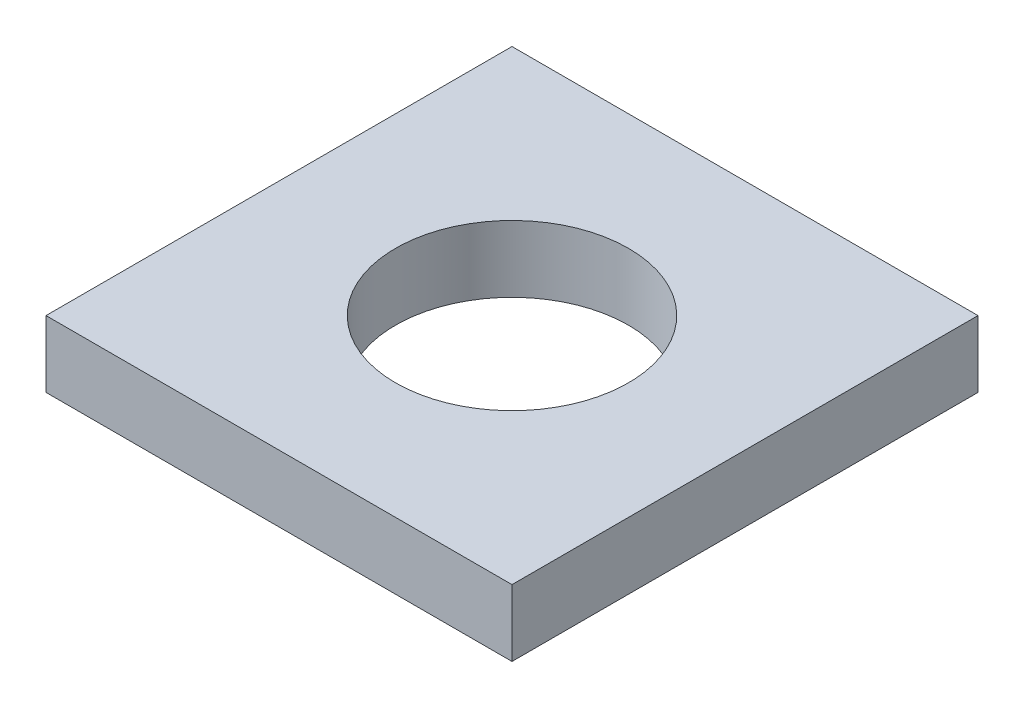
ISO-10303-21;
HEADER;
FILE_DESCRIPTION(('STEP AP214'),'2;1');
FILE_NAME('part.step','',(''),(''),'','','');
FILE_SCHEMA(('AUTOMOTIVE_DESIGN { 1 0 10303 214 1 1 1 1 }'));
ENDSEC;
DATA;
#1=APPLICATION_CONTEXT('core data for automotive mechanical design processes');
#2=APPLICATION_PROTOCOL_DEFINITION('international standard','automotive_design',2000,#1);
#3=PRODUCT_CONTEXT('',#1,'mechanical');
#4=PRODUCT('Part','Part','',(#3));
#5=PRODUCT_RELATED_PRODUCT_CATEGORY('part','',(#4));
#6=PRODUCT_DEFINITION_FORMATION('','',#4);
#7=PRODUCT_DEFINITION_CONTEXT('part definition',#1,'design');
#8=PRODUCT_DEFINITION('design','',#6,#7);
#9=PRODUCT_DEFINITION_SHAPE('','',#8);
#10=(LENGTH_UNIT() NAMED_UNIT(*) SI_UNIT(.MILLI.,.METRE.));
#11=(NAMED_UNIT(*) PLANE_ANGLE_UNIT() SI_UNIT($,.RADIAN.));
#12=(NAMED_UNIT(*) SI_UNIT($,.STERADIAN.) SOLID_ANGLE_UNIT());
#13=UNCERTAINTY_MEASURE_WITH_UNIT(LENGTH_MEASURE(1.E-05),#10,'distance_accuracy_value','');
#14=(GEOMETRIC_REPRESENTATION_CONTEXT(3) GLOBAL_UNCERTAINTY_ASSIGNED_CONTEXT((#13)) GLOBAL_UNIT_ASSIGNED_CONTEXT((#10,
#11,#12)) REPRESENTATION_CONTEXT('',''));
#15=CARTESIAN_POINT('',(0.,0.,0.));
#16=DIRECTION('',(0.,0.,1.));
#17=DIRECTION('',(1.,0.,0.));
#18=AXIS2_PLACEMENT_3D('',#15,#16,#17);
#19=CARTESIAN_POINT('',(0.,1.,0.));
#20=DIRECTION('',(0.,1.,0.));
#21=DIRECTION('',(0.,0.,1.));
#22=AXIS2_PLACEMENT_3D('',#19,#20,#21);
#23=PLANE('',#22);
#24=DIRECTION('',(0.,0.,1.));
#25=VECTOR('',#24,1.);
#26=CARTESIAN_POINT('',(-3.5,1.,-3.5));
#27=LINE('',#26,#25);
#28=CARTESIAN_POINT('',(-3.5,1.,-3.5));
#29=VERTEX_POINT('',#28);
#30=CARTESIAN_POINT('',(-3.5,1.,3.5));
#31=VERTEX_POINT('',#30);
#32=EDGE_CURVE('E102',#29,#31,#27,.T.);
#33=ORIENTED_EDGE('',*,*,#32,.T.);
#34=DIRECTION('',(1.,0.,0.));
#35=VECTOR('',#34,1.);
#36=CARTESIAN_POINT('',(-3.5,1.,3.5));
#37=LINE('',#36,#35);
#38=CARTESIAN_POINT('',(3.5,1.,3.5));
#39=VERTEX_POINT('',#38);
#40=EDGE_CURVE('E94',#31,#39,#37,.T.);
#41=ORIENTED_EDGE('',*,*,#40,.T.);
#42=DIRECTION('',(0.,0.,1.));
#43=VECTOR('',#42,1.);
#44=CARTESIAN_POINT('',(3.5,1.,-3.5));
#45=LINE('',#44,#43);
#46=CARTESIAN_POINT('',(3.5,1.,-3.5));
#47=VERTEX_POINT('',#46);
#48=EDGE_CURVE('E101',#47,#39,#45,.T.);
#49=ORIENTED_EDGE('',*,*,#48,.F.);
#50=DIRECTION('',(1.,0.,0.));
#51=VECTOR('',#50,1.);
#52=CARTESIAN_POINT('',(-3.5,1.,-3.5));
#53=LINE('',#52,#51);
#54=EDGE_CURVE('E111',#29,#47,#53,.T.);
#55=ORIENTED_EDGE('',*,*,#54,.F.);
#56=EDGE_LOOP('',(#33,#41,#49,#55));
#57=FACE_BOUND('',#56,.T.);
#58=CARTESIAN_POINT('',(0.,1.,0.));
#59=DIRECTION('',(0.,1.,0.));
#60=DIRECTION('',(0.,0.,1.));
#61=AXIS2_PLACEMENT_3D('',#58,#59,#60);
#62=CIRCLE('',#61,1.75);
#63=CARTESIAN_POINT('',(0.,1.,1.75000000000001));
#64=VERTEX_POINT('',#63);
#65=EDGE_CURVE('E118',#64,#64,#62,.T.);
#66=ORIENTED_EDGE('',*,*,#65,.F.);
#67=EDGE_LOOP('',(#66));
#68=FACE_BOUND('',#67,.T.);
#69=ADVANCED_FACE('F52',(#57,#68),#23,.T.);
#70=CARTESIAN_POINT('',(0.,0.,0.));
#71=DIRECTION('',(0.,1.,0.));
#72=DIRECTION('',(0.,0.,1.));
#73=AXIS2_PLACEMENT_3D('',#70,#71,#72);
#74=PLANE('',#73);
#75=DIRECTION('',(0.,0.,1.));
#76=VECTOR('',#75,1.);
#77=CARTESIAN_POINT('',(-3.5,0.,-3.5));
#78=LINE('',#77,#76);
#79=CARTESIAN_POINT('',(-3.5,0.,-3.5));
#80=VERTEX_POINT('',#79);
#81=CARTESIAN_POINT('',(-3.5,0.,3.5));
#82=VERTEX_POINT('',#81);
#83=EDGE_CURVE('E116',#80,#82,#78,.T.);
#84=ORIENTED_EDGE('',*,*,#83,.F.);
#85=DIRECTION('',(1.,0.,0.));
#86=VECTOR('',#85,1.);
#87=CARTESIAN_POINT('',(-3.5,0.,-3.5));
#88=LINE('',#87,#86);
#89=CARTESIAN_POINT('',(3.5,0.,-3.5));
#90=VERTEX_POINT('',#89);
#91=EDGE_CURVE('E122',#80,#90,#88,.T.);
#92=ORIENTED_EDGE('',*,*,#91,.T.);
#93=DIRECTION('',(0.,0.,1.));
#94=VECTOR('',#93,1.);
#95=CARTESIAN_POINT('',(3.5,0.,-3.5));
#96=LINE('',#95,#94);
#97=CARTESIAN_POINT('',(3.5,0.,3.5));
#98=VERTEX_POINT('',#97);
#99=EDGE_CURVE('E120',#90,#98,#96,.T.);
#100=ORIENTED_EDGE('',*,*,#99,.T.);
#101=DIRECTION('',(1.,0.,0.));
#102=VECTOR('',#101,1.);
#103=CARTESIAN_POINT('',(-3.5,0.,3.5));
#104=LINE('',#103,#102);
#105=EDGE_CURVE('E107',#82,#98,#104,.T.);
#106=ORIENTED_EDGE('',*,*,#105,.F.);
#107=EDGE_LOOP('',(#84,#92,#100,#106));
#108=FACE_BOUND('',#107,.T.);
#109=CARTESIAN_POINT('',(0.,0.,0.));
#110=DIRECTION('',(0.,1.,0.));
#111=DIRECTION('',(0.,0.,1.));
#112=AXIS2_PLACEMENT_3D('',#109,#110,#111);
#113=CIRCLE('',#112,1.75);
#114=CARTESIAN_POINT('',(0.,0.,1.75000000000001));
#115=VERTEX_POINT('',#114);
#116=EDGE_CURVE('E128',#115,#115,#113,.T.);
#117=ORIENTED_EDGE('',*,*,#116,.T.);
#118=EDGE_LOOP('',(#117));
#119=FACE_BOUND('',#118,.T.);
#120=ADVANCED_FACE('F137',(#108,#119),#74,.F.);
#121=CARTESIAN_POINT('',(-3.5,1.,-3.5));
#122=DIRECTION('',(1.,0.,0.));
#123=DIRECTION('',(0.,0.,-1.));
#124=AXIS2_PLACEMENT_3D('',#121,#122,#123);
#125=PLANE('',#124);
#126=ORIENTED_EDGE('',*,*,#83,.T.);
#127=DIRECTION('',(0.,-1.,0.));
#128=VECTOR('',#127,1.);
#129=CARTESIAN_POINT('',(-3.5,1.,3.5));
#130=LINE('',#129,#128);
#131=EDGE_CURVE('E12',#31,#82,#130,.T.);
#132=ORIENTED_EDGE('',*,*,#131,.F.);
#133=ORIENTED_EDGE('',*,*,#32,.F.);
#134=DIRECTION('',(0.,-1.,0.));
#135=VECTOR('',#134,1.);
#136=CARTESIAN_POINT('',(-3.5,1.,-3.5));
#137=LINE('',#136,#135);
#138=EDGE_CURVE('E69',#29,#80,#137,.T.);
#139=ORIENTED_EDGE('',*,*,#138,.T.);
#140=EDGE_LOOP('',(#126,#132,#133,#139));
#141=FACE_BOUND('',#140,.T.);
#142=ADVANCED_FACE('F54',(#141),#125,.F.);
#143=CARTESIAN_POINT('',(-3.5,1.,3.5));
#144=DIRECTION('',(0.,0.,-1.));
#145=DIRECTION('',(-1.,0.,0.));
#146=AXIS2_PLACEMENT_3D('',#143,#144,#145);
#147=PLANE('',#146);
#148=ORIENTED_EDGE('',*,*,#105,.T.);
#149=DIRECTION('',(0.,-1.,0.));
#150=VECTOR('',#149,1.);
#151=CARTESIAN_POINT('',(3.5,1.,3.5));
#152=LINE('',#151,#150);
#153=EDGE_CURVE('E61',#39,#98,#152,.T.);
#154=ORIENTED_EDGE('',*,*,#153,.F.);
#155=ORIENTED_EDGE('',*,*,#40,.F.);
#156=ORIENTED_EDGE('',*,*,#131,.T.);
#157=EDGE_LOOP('',(#148,#154,#155,#156));
#158=FACE_BOUND('',#157,.T.);
#159=ADVANCED_FACE('F106',(#158),#147,.F.);
#160=CARTESIAN_POINT('',(3.5,1.,-3.5));
#161=DIRECTION('',(1.,0.,0.));
#162=DIRECTION('',(0.,0.,-1.));
#163=AXIS2_PLACEMENT_3D('',#160,#161,#162);
#164=PLANE('',#163);
#165=ORIENTED_EDGE('',*,*,#99,.F.);
#166=DIRECTION('',(0.,-1.,0.));
#167=VECTOR('',#166,1.);
#168=CARTESIAN_POINT('',(3.5,1.,-3.5));
#169=LINE('',#168,#167);
#170=EDGE_CURVE('E83',#47,#90,#169,.T.);
#171=ORIENTED_EDGE('',*,*,#170,.F.);
#172=ORIENTED_EDGE('',*,*,#48,.T.);
#173=ORIENTED_EDGE('',*,*,#153,.T.);
#174=EDGE_LOOP('',(#165,#171,#172,#173));
#175=FACE_BOUND('',#174,.T.);
#176=ADVANCED_FACE('F110',(#175),#164,.T.);
#177=CARTESIAN_POINT('',(-3.5,1.,-3.5));
#178=DIRECTION('',(0.,0.,-1.));
#179=DIRECTION('',(-1.,0.,0.));
#180=AXIS2_PLACEMENT_3D('',#177,#178,#179);
#181=PLANE('',#180);
#182=ORIENTED_EDGE('',*,*,#91,.F.);
#183=ORIENTED_EDGE('',*,*,#138,.F.);
#184=ORIENTED_EDGE('',*,*,#54,.T.);
#185=ORIENTED_EDGE('',*,*,#170,.T.);
#186=EDGE_LOOP('',(#182,#183,#184,#185));
#187=FACE_BOUND('',#186,.T.);
#188=ADVANCED_FACE('F145',(#187),#181,.T.);
#189=CARTESIAN_POINT('',(0.,1.,0.));
#190=DIRECTION('',(0.,-1.,0.));
#191=DIRECTION('',(0.,0.,-1.));
#192=AXIS2_PLACEMENT_3D('',#189,#190,#191);
#193=CYLINDRICAL_SURFACE('',#192,1.75);
#194=ORIENTED_EDGE('',*,*,#65,.T.);
#195=EDGE_LOOP('',(#194));
#196=FACE_BOUND('',#195,.T.);
#197=ORIENTED_EDGE('',*,*,#116,.F.);
#198=EDGE_LOOP('',(#197));
#199=FACE_BOUND('',#198,.T.);
#200=ADVANCED_FACE('F134',(#196,#199),#193,.F.);
#201=CLOSED_SHELL('',(#69,#120,#142,#159,#176,#188,#200));
#202=MANIFOLD_SOLID_BREP('B2',#201);
#203=ADVANCED_BREP_SHAPE_REPRESENTATION('',(#18,#202),#14);
#204=SHAPE_DEFINITION_REPRESENTATION(#9,#203);
ENDSEC;
END-ISO-10303-21;
